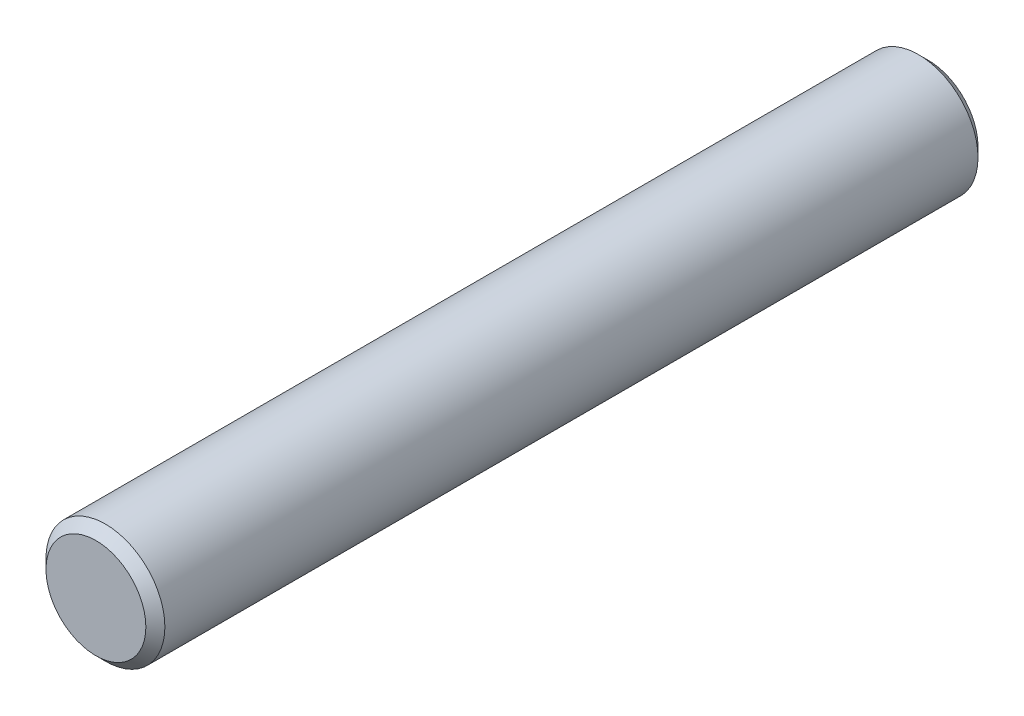
ISO-10303-21;
HEADER;
FILE_DESCRIPTION(('STEP AP214'),'2;1');
FILE_NAME('part.step','',(''),(''),'','','');
FILE_SCHEMA(('AUTOMOTIVE_DESIGN { 1 0 10303 214 1 1 1 1 }'));
ENDSEC;
DATA;
#1=APPLICATION_CONTEXT('core data for automotive mechanical design processes');
#2=APPLICATION_PROTOCOL_DEFINITION('international standard','automotive_design',2000,#1);
#3=PRODUCT_CONTEXT('',#1,'mechanical');
#4=PRODUCT('Part','Part','',(#3));
#5=PRODUCT_RELATED_PRODUCT_CATEGORY('part','',(#4));
#6=PRODUCT_DEFINITION_FORMATION('','',#4);
#7=PRODUCT_DEFINITION_CONTEXT('part definition',#1,'design');
#8=PRODUCT_DEFINITION('design','',#6,#7);
#9=PRODUCT_DEFINITION_SHAPE('','',#8);
#10=(LENGTH_UNIT() NAMED_UNIT(*) SI_UNIT(.MILLI.,.METRE.));
#11=(NAMED_UNIT(*) PLANE_ANGLE_UNIT() SI_UNIT($,.RADIAN.));
#12=(NAMED_UNIT(*) SI_UNIT($,.STERADIAN.) SOLID_ANGLE_UNIT());
#13=UNCERTAINTY_MEASURE_WITH_UNIT(LENGTH_MEASURE(1.E-05),#10,'distance_accuracy_value','');
#14=(GEOMETRIC_REPRESENTATION_CONTEXT(3) GLOBAL_UNCERTAINTY_ASSIGNED_CONTEXT((#13)) GLOBAL_UNIT_ASSIGNED_CONTEXT((#10,
#11,#12)) REPRESENTATION_CONTEXT('',''));
#15=CARTESIAN_POINT('',(0.,0.,0.));
#16=DIRECTION('',(0.,0.,1.));
#17=DIRECTION('',(1.,0.,0.));
#18=AXIS2_PLACEMENT_3D('',#15,#16,#17);
#19=CARTESIAN_POINT('',(0.,0.,22.225));
#20=DIRECTION('',(0.,0.,-1.));
#21=DIRECTION('',(-1.,0.,0.));
#22=AXIS2_PLACEMENT_3D('',#19,#20,#21);
#23=CYLINDRICAL_SURFACE('',#22,1.5875);
#24=CARTESIAN_POINT('',(0.,0.,0.254000000000001));
#25=DIRECTION('',(0.,0.,1.));
#26=DIRECTION('',(1.,0.,0.));
#27=AXIS2_PLACEMENT_3D('',#24,#25,#26);
#28=CIRCLE('',#27,1.5875);
#29=CARTESIAN_POINT('',(1.5875,0.,0.254000000000001));
#30=VERTEX_POINT('',#29);
#31=EDGE_CURVE('E47',#30,#30,#28,.T.);
#32=ORIENTED_EDGE('',*,*,#31,.T.);
#33=EDGE_LOOP('',(#32));
#34=FACE_BOUND('',#33,.T.);
#35=CARTESIAN_POINT('',(0.,0.,21.971));
#36=DIRECTION('',(0.,0.,1.));
#37=DIRECTION('',(1.,0.,0.));
#38=AXIS2_PLACEMENT_3D('',#35,#36,#37);
#39=CIRCLE('',#38,1.5875);
#40=CARTESIAN_POINT('',(1.5875,0.,21.971));
#41=VERTEX_POINT('',#40);
#42=EDGE_CURVE('E51',#41,#41,#39,.F.);
#43=ORIENTED_EDGE('',*,*,#42,.T.);
#44=EDGE_LOOP('',(#43));
#45=FACE_BOUND('',#44,.T.);
#46=ADVANCED_FACE('F35',(#34,#45),#23,.T.);
#47=CARTESIAN_POINT('',(0.,0.,22.225));
#48=DIRECTION('',(0.,0.,1.));
#49=DIRECTION('',(1.,0.,0.));
#50=AXIS2_PLACEMENT_3D('',#47,#48,#49);
#51=PLANE('',#50);
#52=CARTESIAN_POINT('',(0.,0.,22.225));
#53=DIRECTION('',(0.,0.,1.));
#54=DIRECTION('',(1.,0.,0.));
#55=AXIS2_PLACEMENT_3D('',#52,#53,#54);
#56=CIRCLE('',#55,1.3335);
#57=CARTESIAN_POINT('',(1.3335,0.,22.225));
#58=VERTEX_POINT('',#57);
#59=EDGE_CURVE('E10',#58,#58,#56,.T.);
#60=ORIENTED_EDGE('',*,*,#59,.T.);
#61=EDGE_LOOP('',(#60));
#62=FACE_BOUND('',#61,.T.);
#63=ADVANCED_FACE('F67',(#62),#51,.T.);
#64=CARTESIAN_POINT('',(0.,0.,0.));
#65=DIRECTION('',(0.,0.,1.));
#66=DIRECTION('',(1.,0.,0.));
#67=AXIS2_PLACEMENT_3D('',#64,#65,#66);
#68=PLANE('',#67);
#69=CARTESIAN_POINT('',(0.,0.,0.));
#70=DIRECTION('',(0.,0.,1.));
#71=DIRECTION('',(1.,0.,0.));
#72=AXIS2_PLACEMENT_3D('',#69,#70,#71);
#73=CIRCLE('',#72,1.3335);
#74=CARTESIAN_POINT('',(1.3335,0.,0.));
#75=VERTEX_POINT('',#74);
#76=EDGE_CURVE('E43',#75,#75,#73,.F.);
#77=ORIENTED_EDGE('',*,*,#76,.T.);
#78=EDGE_LOOP('',(#77));
#79=FACE_BOUND('',#78,.T.);
#80=ADVANCED_FACE('F64',(#79),#68,.F.);
#81=CARTESIAN_POINT('',(0.,0.,0.254000000000001));
#82=DIRECTION('',(0.,0.,1.));
#83=DIRECTION('',(1.,0.,0.));
#84=AXIS2_PLACEMENT_3D('',#81,#82,#83);
#85=CONICAL_SURFACE('',#84,1.5875,0.785398163397454);
#86=ORIENTED_EDGE('',*,*,#76,.F.);
#87=EDGE_LOOP('',(#86));
#88=FACE_BOUND('',#87,.T.);
#89=ORIENTED_EDGE('',*,*,#31,.F.);
#90=EDGE_LOOP('',(#89));
#91=FACE_BOUND('',#90,.T.);
#92=ADVANCED_FACE('F60',(#88,#91),#85,.T.);
#93=CARTESIAN_POINT('',(0.,0.,22.225));
#94=DIRECTION('',(0.,0.,-1.));
#95=DIRECTION('',(-1.,0.,0.));
#96=AXIS2_PLACEMENT_3D('',#93,#94,#95);
#97=CONICAL_SURFACE('',#96,1.3335,0.785398163397444);
#98=ORIENTED_EDGE('',*,*,#42,.F.);
#99=EDGE_LOOP('',(#98));
#100=FACE_BOUND('',#99,.T.);
#101=ORIENTED_EDGE('',*,*,#59,.F.);
#102=EDGE_LOOP('',(#101));
#103=FACE_BOUND('',#102,.T.);
#104=ADVANCED_FACE('F38',(#100,#103),#97,.T.);
#105=CLOSED_SHELL('',(#46,#63,#80,#92,#104));
#106=MANIFOLD_SOLID_BREP('B2',#105);
#107=ADVANCED_BREP_SHAPE_REPRESENTATION('',(#18,#106),#14);
#108=SHAPE_DEFINITION_REPRESENTATION(#9,#107);
ENDSEC;
END-ISO-10303-21;
